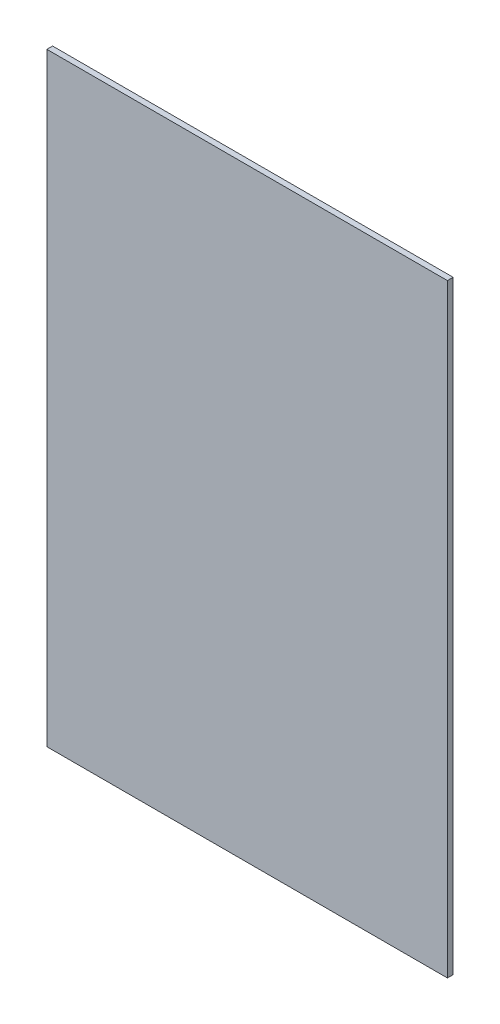
ISO-10303-21;
HEADER;
FILE_DESCRIPTION(('STEP AP214'),'2;1');
FILE_NAME('part.step','',(''),(''),'','','');
FILE_SCHEMA(('AUTOMOTIVE_DESIGN { 1 0 10303 214 1 1 1 1 }'));
ENDSEC;
DATA;
#1=APPLICATION_CONTEXT('core data for automotive mechanical design processes');
#2=APPLICATION_PROTOCOL_DEFINITION('international standard','automotive_design',2000,#1);
#3=PRODUCT_CONTEXT('',#1,'mechanical');
#4=PRODUCT('Part','Part','',(#3));
#5=PRODUCT_RELATED_PRODUCT_CATEGORY('part','',(#4));
#6=PRODUCT_DEFINITION_FORMATION('','',#4);
#7=PRODUCT_DEFINITION_CONTEXT('part definition',#1,'design');
#8=PRODUCT_DEFINITION('design','',#6,#7);
#9=PRODUCT_DEFINITION_SHAPE('','',#8);
#10=(LENGTH_UNIT() NAMED_UNIT(*) SI_UNIT(.MILLI.,.METRE.));
#11=(NAMED_UNIT(*) PLANE_ANGLE_UNIT() SI_UNIT($,.RADIAN.));
#12=(NAMED_UNIT(*) SI_UNIT($,.STERADIAN.) SOLID_ANGLE_UNIT());
#13=UNCERTAINTY_MEASURE_WITH_UNIT(LENGTH_MEASURE(1.E-05),#10,'distance_accuracy_value','');
#14=(GEOMETRIC_REPRESENTATION_CONTEXT(3) GLOBAL_UNCERTAINTY_ASSIGNED_CONTEXT((#13)) GLOBAL_UNIT_ASSIGNED_CONTEXT((#10,
#11,#12)) REPRESENTATION_CONTEXT('',''));
#15=CARTESIAN_POINT('',(0.,0.,0.));
#16=DIRECTION('',(0.,0.,1.));
#17=DIRECTION('',(1.,0.,0.));
#18=AXIS2_PLACEMENT_3D('',#15,#16,#17);
#19=CARTESIAN_POINT('',(350.,527.7,10.));
#20=DIRECTION('',(-1.,0.,0.));
#21=DIRECTION('',(0.,-1.,0.));
#22=AXIS2_PLACEMENT_3D('',#19,#20,#21);
#23=PLANE('',#22);
#24=DIRECTION('',(0.,1.,0.));
#25=VECTOR('',#24,1.);
#26=CARTESIAN_POINT('',(350.,527.7,0.));
#27=LINE('',#26,#25);
#28=CARTESIAN_POINT('',(350.,-527.7,0.));
#29=VERTEX_POINT('',#28);
#30=CARTESIAN_POINT('',(350.,527.7,0.));
#31=VERTEX_POINT('',#30);
#32=EDGE_CURVE('E98',#29,#31,#27,.T.);
#33=ORIENTED_EDGE('',*,*,#32,.T.);
#34=DIRECTION('',(0.,0.,-1.));
#35=VECTOR('',#34,1.);
#36=CARTESIAN_POINT('',(350.,527.7,10.));
#37=LINE('',#36,#35);
#38=CARTESIAN_POINT('',(350.,527.7,10.));
#39=VERTEX_POINT('',#38);
#40=EDGE_CURVE('E11',#39,#31,#37,.T.);
#41=ORIENTED_EDGE('',*,*,#40,.F.);
#42=DIRECTION('',(0.,1.,0.));
#43=VECTOR('',#42,1.);
#44=CARTESIAN_POINT('',(350.,527.7,10.));
#45=LINE('',#44,#43);
#46=CARTESIAN_POINT('',(350.,-527.7,10.));
#47=VERTEX_POINT('',#46);
#48=EDGE_CURVE('E86',#47,#39,#45,.T.);
#49=ORIENTED_EDGE('',*,*,#48,.F.);
#50=DIRECTION('',(0.,0.,-1.));
#51=VECTOR('',#50,1.);
#52=CARTESIAN_POINT('',(350.,-527.7,10.));
#53=LINE('',#52,#51);
#54=EDGE_CURVE('E94',#47,#29,#53,.T.);
#55=ORIENTED_EDGE('',*,*,#54,.T.);
#56=EDGE_LOOP('',(#33,#41,#49,#55));
#57=FACE_BOUND('',#56,.T.);
#58=ADVANCED_FACE('F35',(#57),#23,.F.);
#59=CARTESIAN_POINT('',(-350.,527.7,10.));
#60=DIRECTION('',(0.,-1.,0.));
#61=DIRECTION('',(0.,0.,-1.));
#62=AXIS2_PLACEMENT_3D('',#59,#60,#61);
#63=PLANE('',#62);
#64=DIRECTION('',(-1.,0.,0.));
#65=VECTOR('',#64,1.);
#66=CARTESIAN_POINT('',(-350.,527.7,0.));
#67=LINE('',#66,#65);
#68=CARTESIAN_POINT('',(-350.,527.7,0.));
#69=VERTEX_POINT('',#68);
#70=EDGE_CURVE('E90',#31,#69,#67,.T.);
#71=ORIENTED_EDGE('',*,*,#70,.T.);
#72=DIRECTION('',(0.,0.,-1.));
#73=VECTOR('',#72,1.);
#74=CARTESIAN_POINT('',(-350.,527.7,10.));
#75=LINE('',#74,#73);
#76=CARTESIAN_POINT('',(-350.,527.7,10.));
#77=VERTEX_POINT('',#76);
#78=EDGE_CURVE('E43',#77,#69,#75,.T.);
#79=ORIENTED_EDGE('',*,*,#78,.F.);
#80=DIRECTION('',(-1.,0.,0.));
#81=VECTOR('',#80,1.);
#82=CARTESIAN_POINT('',(-350.,527.7,10.));
#83=LINE('',#82,#81);
#84=EDGE_CURVE('E81',#39,#77,#83,.T.);
#85=ORIENTED_EDGE('',*,*,#84,.F.);
#86=ORIENTED_EDGE('',*,*,#40,.T.);
#87=EDGE_LOOP('',(#71,#79,#85,#86));
#88=FACE_BOUND('',#87,.T.);
#89=ADVANCED_FACE('F89',(#88),#63,.F.);
#90=CARTESIAN_POINT('',(-350.,527.7,10.));
#91=DIRECTION('',(1.,0.,0.));
#92=DIRECTION('',(0.,1.,0.));
#93=AXIS2_PLACEMENT_3D('',#90,#91,#92);
#94=PLANE('',#93);
#95=DIRECTION('',(0.,-1.,0.));
#96=VECTOR('',#95,1.);
#97=CARTESIAN_POINT('',(-350.,527.7,0.));
#98=LINE('',#97,#96);
#99=CARTESIAN_POINT('',(-350.,-527.7,0.));
#100=VERTEX_POINT('',#99);
#101=EDGE_CURVE('E68',#69,#100,#98,.T.);
#102=ORIENTED_EDGE('',*,*,#101,.T.);
#103=DIRECTION('',(0.,0.,-1.));
#104=VECTOR('',#103,1.);
#105=CARTESIAN_POINT('',(-350.,-527.7,10.));
#106=LINE('',#105,#104);
#107=CARTESIAN_POINT('',(-350.,-527.7,10.));
#108=VERTEX_POINT('',#107);
#109=EDGE_CURVE('E91',#108,#100,#106,.T.);
#110=ORIENTED_EDGE('',*,*,#109,.F.);
#111=DIRECTION('',(0.,-1.,0.));
#112=VECTOR('',#111,1.);
#113=CARTESIAN_POINT('',(-350.,527.7,10.));
#114=LINE('',#113,#112);
#115=EDGE_CURVE('E84',#77,#108,#114,.T.);
#116=ORIENTED_EDGE('',*,*,#115,.F.);
#117=ORIENTED_EDGE('',*,*,#78,.T.);
#118=EDGE_LOOP('',(#102,#110,#116,#117));
#119=FACE_BOUND('',#118,.T.);
#120=ADVANCED_FACE('F92',(#119),#94,.F.);
#121=CARTESIAN_POINT('',(-350.,-527.7,10.));
#122=DIRECTION('',(0.,1.,0.));
#123=DIRECTION('',(0.,0.,1.));
#124=AXIS2_PLACEMENT_3D('',#121,#122,#123);
#125=PLANE('',#124);
#126=DIRECTION('',(1.,0.,0.));
#127=VECTOR('',#126,1.);
#128=CARTESIAN_POINT('',(-350.,-527.7,0.));
#129=LINE('',#128,#127);
#130=EDGE_CURVE('E74',#100,#29,#129,.T.);
#131=ORIENTED_EDGE('',*,*,#130,.T.);
#132=ORIENTED_EDGE('',*,*,#54,.F.);
#133=DIRECTION('',(1.,0.,0.));
#134=VECTOR('',#133,1.);
#135=CARTESIAN_POINT('',(-350.,-527.7,10.));
#136=LINE('',#135,#134);
#137=EDGE_CURVE('E51',#108,#47,#136,.T.);
#138=ORIENTED_EDGE('',*,*,#137,.F.);
#139=ORIENTED_EDGE('',*,*,#109,.T.);
#140=EDGE_LOOP('',(#131,#132,#138,#139));
#141=FACE_BOUND('',#140,.T.);
#142=ADVANCED_FACE('F105',(#141),#125,.F.);
#143=CARTESIAN_POINT('',(0.,0.,10.));
#144=DIRECTION('',(0.,0.,1.));
#145=DIRECTION('',(1.,0.,0.));
#146=AXIS2_PLACEMENT_3D('',#143,#144,#145);
#147=PLANE('',#146);
#148=ORIENTED_EDGE('',*,*,#48,.T.);
#149=ORIENTED_EDGE('',*,*,#84,.T.);
#150=ORIENTED_EDGE('',*,*,#115,.T.);
#151=ORIENTED_EDGE('',*,*,#137,.T.);
#152=EDGE_LOOP('',(#148,#149,#150,#151));
#153=FACE_BOUND('',#152,.T.);
#154=ADVANCED_FACE('F82',(#153),#147,.T.);
#155=CARTESIAN_POINT('',(0.,0.,0.));
#156=DIRECTION('',(0.,0.,1.));
#157=DIRECTION('',(1.,0.,0.));
#158=AXIS2_PLACEMENT_3D('',#155,#156,#157);
#159=PLANE('',#158);
#160=ORIENTED_EDGE('',*,*,#32,.F.);
#161=ORIENTED_EDGE('',*,*,#130,.F.);
#162=ORIENTED_EDGE('',*,*,#101,.F.);
#163=ORIENTED_EDGE('',*,*,#70,.F.);
#164=EDGE_LOOP('',(#160,#161,#162,#163));
#165=FACE_BOUND('',#164,.T.);
#166=ADVANCED_FACE('F108',(#165),#159,.F.);
#167=CLOSED_SHELL('',(#58,#89,#120,#142,#154,#166));
#168=MANIFOLD_SOLID_BREP('B2',#167);
#169=ADVANCED_BREP_SHAPE_REPRESENTATION('',(#18,#168),#14);
#170=SHAPE_DEFINITION_REPRESENTATION(#9,#169);
ENDSEC;
END-ISO-10303-21;
